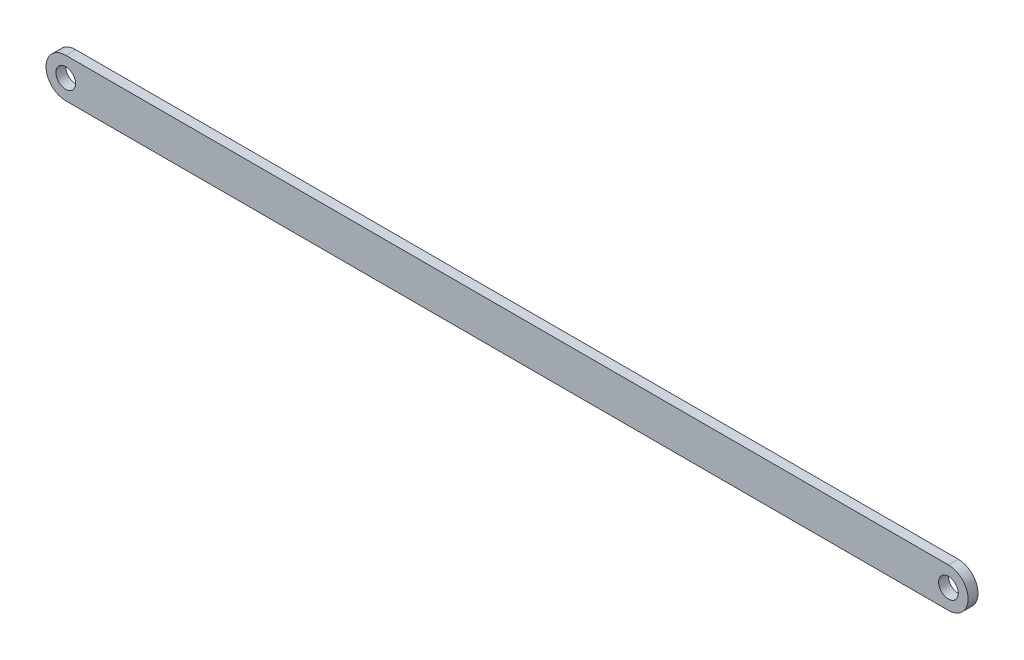
ISO-10303-21;
HEADER;
FILE_DESCRIPTION(('STEP AP214'),'2;1');
FILE_NAME('part.step','',(''),(''),'','','');
FILE_SCHEMA(('AUTOMOTIVE_DESIGN { 1 0 10303 214 1 1 1 1 }'));
ENDSEC;
DATA;
#1=APPLICATION_CONTEXT('core data for automotive mechanical design processes');
#2=APPLICATION_PROTOCOL_DEFINITION('international standard','automotive_design',2000,#1);
#3=PRODUCT_CONTEXT('',#1,'mechanical');
#4=PRODUCT('Part','Part','',(#3));
#5=PRODUCT_RELATED_PRODUCT_CATEGORY('part','',(#4));
#6=PRODUCT_DEFINITION_FORMATION('','',#4);
#7=PRODUCT_DEFINITION_CONTEXT('part definition',#1,'design');
#8=PRODUCT_DEFINITION('design','',#6,#7);
#9=PRODUCT_DEFINITION_SHAPE('','',#8);
#10=(LENGTH_UNIT() NAMED_UNIT(*) SI_UNIT(.MILLI.,.METRE.));
#11=(NAMED_UNIT(*) PLANE_ANGLE_UNIT() SI_UNIT($,.RADIAN.));
#12=(NAMED_UNIT(*) SI_UNIT($,.STERADIAN.) SOLID_ANGLE_UNIT());
#13=UNCERTAINTY_MEASURE_WITH_UNIT(LENGTH_MEASURE(1.E-05),#10,'distance_accuracy_value','');
#14=(GEOMETRIC_REPRESENTATION_CONTEXT(3) GLOBAL_UNCERTAINTY_ASSIGNED_CONTEXT((#13)) GLOBAL_UNIT_ASSIGNED_CONTEXT((#10,
#11,#12)) REPRESENTATION_CONTEXT('',''));
#15=CARTESIAN_POINT('',(0.,0.,0.));
#16=DIRECTION('',(0.,0.,1.));
#17=DIRECTION('',(1.,0.,0.));
#18=AXIS2_PLACEMENT_3D('',#15,#16,#17);
#19=CARTESIAN_POINT('',(44.785,0.,1.));
#20=DIRECTION('',(0.,0.,-1.));
#21=DIRECTION('',(-1.,0.,0.));
#22=AXIS2_PLACEMENT_3D('',#19,#20,#21);
#23=PLANE('',#22);
#24=CARTESIAN_POINT('',(44.785,0.,1.));
#25=DIRECTION('',(0.,0.,1.));
#26=DIRECTION('',(-1.,0.,0.));
#27=AXIS2_PLACEMENT_3D('',#24,#25,#26);
#28=CIRCLE('',#27,2.);
#29=CARTESIAN_POINT('',(44.785,-2.,1.));
#30=VERTEX_POINT('',#29);
#31=CARTESIAN_POINT('',(44.785,2.,1.));
#32=VERTEX_POINT('',#31);
#33=EDGE_CURVE('E90',#30,#32,#28,.T.);
#34=ORIENTED_EDGE('',*,*,#33,.T.);
#35=DIRECTION('',(-1.,0.,0.));
#36=VECTOR('',#35,1.);
#37=CARTESIAN_POINT('',(-44.785,2.,1.));
#38=LINE('',#37,#36);
#39=CARTESIAN_POINT('',(-44.785,2.,1.));
#40=VERTEX_POINT('',#39);
#41=EDGE_CURVE('E85',#32,#40,#38,.T.);
#42=ORIENTED_EDGE('',*,*,#41,.T.);
#43=CARTESIAN_POINT('',(-44.785,0.,1.));
#44=DIRECTION('',(0.,0.,1.));
#45=DIRECTION('',(1.,0.,0.));
#46=AXIS2_PLACEMENT_3D('',#43,#44,#45);
#47=CIRCLE('',#46,2.);
#48=CARTESIAN_POINT('',(-44.785,-2.,1.));
#49=VERTEX_POINT('',#48);
#50=EDGE_CURVE('E88',#40,#49,#47,.T.);
#51=ORIENTED_EDGE('',*,*,#50,.T.);
#52=DIRECTION('',(1.,0.,0.));
#53=VECTOR('',#52,1.);
#54=CARTESIAN_POINT('',(-44.785,-2.,1.));
#55=LINE('',#54,#53);
#56=EDGE_CURVE('E55',#49,#30,#55,.T.);
#57=ORIENTED_EDGE('',*,*,#56,.T.);
#58=EDGE_LOOP('',(#34,#42,#51,#57));
#59=FACE_BOUND('',#58,.T.);
#60=CARTESIAN_POINT('',(-44.785,0.,1.));
#61=DIRECTION('',(0.,0.,1.));
#62=DIRECTION('',(1.,0.,0.));
#63=AXIS2_PLACEMENT_3D('',#60,#61,#62);
#64=CIRCLE('',#63,0.999999999999998);
#65=CARTESIAN_POINT('',(-43.785,0.,1.));
#66=VERTEX_POINT('',#65);
#67=EDGE_CURVE('E105',#66,#66,#64,.T.);
#68=ORIENTED_EDGE('',*,*,#67,.F.);
#69=EDGE_LOOP('',(#68));
#70=FACE_BOUND('',#69,.T.);
#71=CARTESIAN_POINT('',(44.785,0.,1.));
#72=DIRECTION('',(0.,0.,1.));
#73=DIRECTION('',(1.,0.,0.));
#74=AXIS2_PLACEMENT_3D('',#71,#72,#73);
#75=CIRCLE('',#74,0.999999999999998);
#76=CARTESIAN_POINT('',(45.785,0.,1.));
#77=VERTEX_POINT('',#76);
#78=EDGE_CURVE('E120',#77,#77,#75,.T.);
#79=ORIENTED_EDGE('',*,*,#78,.F.);
#80=EDGE_LOOP('',(#79));
#81=FACE_BOUND('',#80,.T.);
#82=ADVANCED_FACE('F38',(#59,#70,#81),#23,.F.);
#83=CARTESIAN_POINT('',(44.785,0.,0.));
#84=DIRECTION('',(0.,0.,-1.));
#85=DIRECTION('',(-1.,0.,0.));
#86=AXIS2_PLACEMENT_3D('',#83,#84,#85);
#87=PLANE('',#86);
#88=CARTESIAN_POINT('',(-44.785,0.,0.));
#89=DIRECTION('',(0.,0.,1.));
#90=DIRECTION('',(1.,0.,0.));
#91=AXIS2_PLACEMENT_3D('',#88,#89,#90);
#92=CIRCLE('',#91,0.999999999999998);
#93=CARTESIAN_POINT('',(-43.785,0.,0.));
#94=VERTEX_POINT('',#93);
#95=EDGE_CURVE('E117',#94,#94,#92,.T.);
#96=ORIENTED_EDGE('',*,*,#95,.T.);
#97=EDGE_LOOP('',(#96));
#98=FACE_BOUND('',#97,.T.);
#99=CARTESIAN_POINT('',(44.785,0.,0.));
#100=DIRECTION('',(0.,0.,1.));
#101=DIRECTION('',(-1.,0.,0.));
#102=AXIS2_PLACEMENT_3D('',#99,#100,#101);
#103=CIRCLE('',#102,2.);
#104=CARTESIAN_POINT('',(44.785,-2.,0.));
#105=VERTEX_POINT('',#104);
#106=CARTESIAN_POINT('',(44.785,2.,0.));
#107=VERTEX_POINT('',#106);
#108=EDGE_CURVE('E102',#105,#107,#103,.T.);
#109=ORIENTED_EDGE('',*,*,#108,.F.);
#110=DIRECTION('',(1.,0.,0.));
#111=VECTOR('',#110,1.);
#112=CARTESIAN_POINT('',(-44.785,-2.,0.));
#113=LINE('',#112,#111);
#114=CARTESIAN_POINT('',(-44.785,-2.,0.));
#115=VERTEX_POINT('',#114);
#116=EDGE_CURVE('E78',#115,#105,#113,.T.);
#117=ORIENTED_EDGE('',*,*,#116,.F.);
#118=CARTESIAN_POINT('',(-44.785,0.,0.));
#119=DIRECTION('',(0.,0.,1.));
#120=DIRECTION('',(1.,0.,0.));
#121=AXIS2_PLACEMENT_3D('',#118,#119,#120);
#122=CIRCLE('',#121,2.);
#123=CARTESIAN_POINT('',(-44.785,2.,0.));
#124=VERTEX_POINT('',#123);
#125=EDGE_CURVE('E72',#124,#115,#122,.T.);
#126=ORIENTED_EDGE('',*,*,#125,.F.);
#127=DIRECTION('',(-1.,0.,0.));
#128=VECTOR('',#127,1.);
#129=CARTESIAN_POINT('',(-44.785,2.,0.));
#130=LINE('',#129,#128);
#131=EDGE_CURVE('E94',#107,#124,#130,.T.);
#132=ORIENTED_EDGE('',*,*,#131,.F.);
#133=EDGE_LOOP('',(#109,#117,#126,#132));
#134=FACE_BOUND('',#133,.T.);
#135=CARTESIAN_POINT('',(44.785,0.,0.));
#136=DIRECTION('',(0.,0.,1.));
#137=DIRECTION('',(1.,0.,0.));
#138=AXIS2_PLACEMENT_3D('',#135,#136,#137);
#139=CIRCLE('',#138,0.999999999999998);
#140=CARTESIAN_POINT('',(45.785,0.,0.));
#141=VERTEX_POINT('',#140);
#142=EDGE_CURVE('E123',#141,#141,#139,.T.);
#143=ORIENTED_EDGE('',*,*,#142,.T.);
#144=EDGE_LOOP('',(#143));
#145=FACE_BOUND('',#144,.T.);
#146=ADVANCED_FACE('F113',(#98,#134,#145),#87,.T.);
#147=CARTESIAN_POINT('',(44.785,0.,1.));
#148=DIRECTION('',(0.,0.,-1.));
#149=DIRECTION('',(-1.,0.,0.));
#150=AXIS2_PLACEMENT_3D('',#147,#148,#149);
#151=CYLINDRICAL_SURFACE('',#150,2.);
#152=ORIENTED_EDGE('',*,*,#108,.T.);
#153=DIRECTION('',(0.,0.,-1.));
#154=VECTOR('',#153,1.);
#155=CARTESIAN_POINT('',(44.785,2.,1.));
#156=LINE('',#155,#154);
#157=EDGE_CURVE('E11',#32,#107,#156,.T.);
#158=ORIENTED_EDGE('',*,*,#157,.F.);
#159=ORIENTED_EDGE('',*,*,#33,.F.);
#160=DIRECTION('',(0.,0.,-1.));
#161=VECTOR('',#160,1.);
#162=CARTESIAN_POINT('',(44.785,-2.,1.));
#163=LINE('',#162,#161);
#164=EDGE_CURVE('E98',#30,#105,#163,.T.);
#165=ORIENTED_EDGE('',*,*,#164,.T.);
#166=EDGE_LOOP('',(#152,#158,#159,#165));
#167=FACE_BOUND('',#166,.T.);
#168=ADVANCED_FACE('F40',(#167),#151,.T.);
#169=CARTESIAN_POINT('',(-44.785,2.,1.));
#170=DIRECTION('',(0.,-1.,0.));
#171=DIRECTION('',(0.,0.,-1.));
#172=AXIS2_PLACEMENT_3D('',#169,#170,#171);
#173=PLANE('',#172);
#174=ORIENTED_EDGE('',*,*,#131,.T.);
#175=DIRECTION('',(0.,0.,-1.));
#176=VECTOR('',#175,1.);
#177=CARTESIAN_POINT('',(-44.785,2.,1.));
#178=LINE('',#177,#176);
#179=EDGE_CURVE('E47',#40,#124,#178,.T.);
#180=ORIENTED_EDGE('',*,*,#179,.F.);
#181=ORIENTED_EDGE('',*,*,#41,.F.);
#182=ORIENTED_EDGE('',*,*,#157,.T.);
#183=EDGE_LOOP('',(#174,#180,#181,#182));
#184=FACE_BOUND('',#183,.T.);
#185=ADVANCED_FACE('F93',(#184),#173,.F.);
#186=CARTESIAN_POINT('',(-44.785,0.,1.));
#187=DIRECTION('',(0.,0.,-1.));
#188=DIRECTION('',(-1.,0.,0.));
#189=AXIS2_PLACEMENT_3D('',#186,#187,#188);
#190=CYLINDRICAL_SURFACE('',#189,2.);
#191=ORIENTED_EDGE('',*,*,#125,.T.);
#192=DIRECTION('',(0.,0.,-1.));
#193=VECTOR('',#192,1.);
#194=CARTESIAN_POINT('',(-44.785,-2.,1.));
#195=LINE('',#194,#193);
#196=EDGE_CURVE('E95',#49,#115,#195,.T.);
#197=ORIENTED_EDGE('',*,*,#196,.F.);
#198=ORIENTED_EDGE('',*,*,#50,.F.);
#199=ORIENTED_EDGE('',*,*,#179,.T.);
#200=EDGE_LOOP('',(#191,#197,#198,#199));
#201=FACE_BOUND('',#200,.T.);
#202=ADVANCED_FACE('F96',(#201),#190,.T.);
#203=CARTESIAN_POINT('',(-44.785,-2.,1.));
#204=DIRECTION('',(0.,1.,0.));
#205=DIRECTION('',(0.,0.,1.));
#206=AXIS2_PLACEMENT_3D('',#203,#204,#205);
#207=PLANE('',#206);
#208=ORIENTED_EDGE('',*,*,#116,.T.);
#209=ORIENTED_EDGE('',*,*,#164,.F.);
#210=ORIENTED_EDGE('',*,*,#56,.F.);
#211=ORIENTED_EDGE('',*,*,#196,.T.);
#212=EDGE_LOOP('',(#208,#209,#210,#211));
#213=FACE_BOUND('',#212,.T.);
#214=ADVANCED_FACE('F110',(#213),#207,.F.);
#215=CARTESIAN_POINT('',(-44.785,0.,1.));
#216=DIRECTION('',(0.,0.,-1.));
#217=DIRECTION('',(-1.,0.,0.));
#218=AXIS2_PLACEMENT_3D('',#215,#216,#217);
#219=CYLINDRICAL_SURFACE('',#218,0.999999999999998);
#220=ORIENTED_EDGE('',*,*,#67,.T.);
#221=EDGE_LOOP('',(#220));
#222=FACE_BOUND('',#221,.T.);
#223=ORIENTED_EDGE('',*,*,#95,.F.);
#224=EDGE_LOOP('',(#223));
#225=FACE_BOUND('',#224,.T.);
#226=ADVANCED_FACE('F140',(#222,#225),#219,.F.);
#227=CARTESIAN_POINT('',(44.785,0.,1.));
#228=DIRECTION('',(0.,0.,-1.));
#229=DIRECTION('',(-1.,0.,0.));
#230=AXIS2_PLACEMENT_3D('',#227,#228,#229);
#231=CYLINDRICAL_SURFACE('',#230,0.999999999999998);
#232=ORIENTED_EDGE('',*,*,#78,.T.);
#233=EDGE_LOOP('',(#232));
#234=FACE_BOUND('',#233,.T.);
#235=ORIENTED_EDGE('',*,*,#142,.F.);
#236=EDGE_LOOP('',(#235));
#237=FACE_BOUND('',#236,.T.);
#238=ADVANCED_FACE('F129',(#234,#237),#231,.F.);
#239=CLOSED_SHELL('',(#82,#146,#168,#185,#202,#214,#226,#238));
#240=MANIFOLD_SOLID_BREP('B2',#239);
#241=ADVANCED_BREP_SHAPE_REPRESENTATION('',(#18,#240),#14);
#242=SHAPE_DEFINITION_REPRESENTATION(#9,#241);
ENDSEC;
END-ISO-10303-21;
